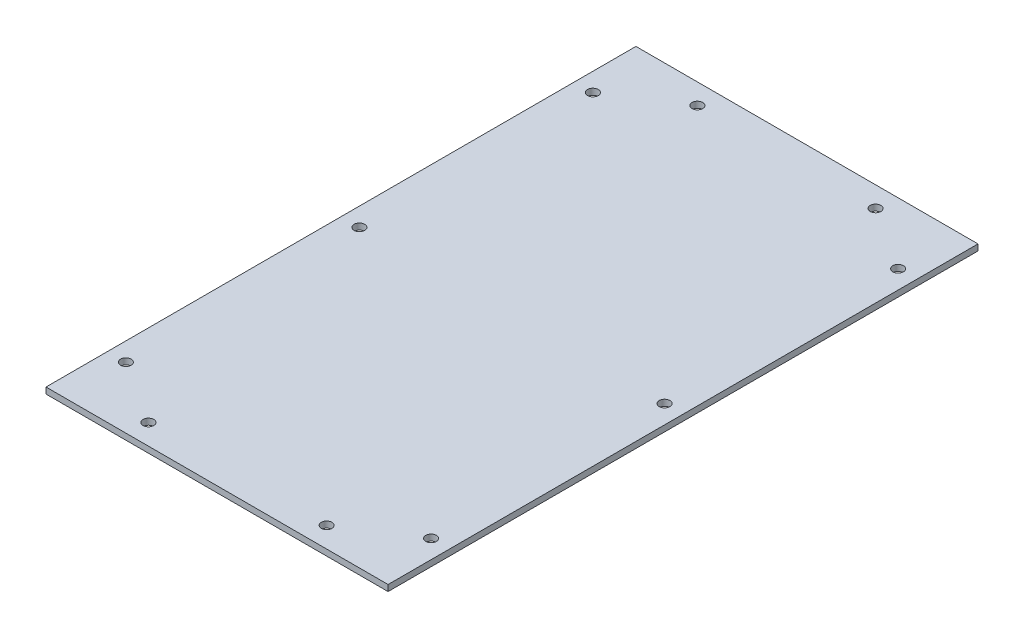
ISO-10303-21;
HEADER;
FILE_DESCRIPTION(('STEP AP214'),'2;1');
FILE_NAME('part.step','',(''),(''),'','','');
FILE_SCHEMA(('AUTOMOTIVE_DESIGN { 1 0 10303 214 1 1 1 1 }'));
ENDSEC;
DATA;
#1=APPLICATION_CONTEXT('core data for automotive mechanical design processes');
#2=APPLICATION_PROTOCOL_DEFINITION('international standard','automotive_design',2000,#1);
#3=PRODUCT_CONTEXT('',#1,'mechanical');
#4=PRODUCT('Part','Part','',(#3));
#5=PRODUCT_RELATED_PRODUCT_CATEGORY('part','',(#4));
#6=PRODUCT_DEFINITION_FORMATION('','',#4);
#7=PRODUCT_DEFINITION_CONTEXT('part definition',#1,'design');
#8=PRODUCT_DEFINITION('design','',#6,#7);
#9=PRODUCT_DEFINITION_SHAPE('','',#8);
#10=(LENGTH_UNIT() NAMED_UNIT(*) SI_UNIT(.MILLI.,.METRE.));
#11=(NAMED_UNIT(*) PLANE_ANGLE_UNIT() SI_UNIT($,.RADIAN.));
#12=(NAMED_UNIT(*) SI_UNIT($,.STERADIAN.) SOLID_ANGLE_UNIT());
#13=UNCERTAINTY_MEASURE_WITH_UNIT(LENGTH_MEASURE(1.E-05),#10,'distance_accuracy_value','');
#14=(GEOMETRIC_REPRESENTATION_CONTEXT(3) GLOBAL_UNCERTAINTY_ASSIGNED_CONTEXT((#13)) GLOBAL_UNIT_ASSIGNED_CONTEXT((#10,
#11,#12)) REPRESENTATION_CONTEXT('',''));
#15=CARTESIAN_POINT('',(0.,0.,0.));
#16=DIRECTION('',(0.,0.,1.));
#17=DIRECTION('',(1.,0.,0.));
#18=AXIS2_PLACEMENT_3D('',#15,#16,#17);
#19=CARTESIAN_POINT('',(0.,3.,0.));
#20=DIRECTION('',(0.,1.,0.));
#21=DIRECTION('',(0.,0.,1.));
#22=AXIS2_PLACEMENT_3D('',#19,#20,#21);
#23=PLANE('',#22);
#24=CARTESIAN_POINT('',(-43.5,3.,134.));
#25=DIRECTION('',(0.,1.,0.));
#26=DIRECTION('',(0.,0.,1.));
#27=AXIS2_PLACEMENT_3D('',#24,#25,#26);
#28=CIRCLE('',#27,2.59999999999999);
#29=CARTESIAN_POINT('',(-43.5,3.,136.6));
#30=VERTEX_POINT('',#29);
#31=EDGE_CURVE('E162',#30,#30,#28,.T.);
#32=ORIENTED_EDGE('',*,*,#31,.F.);
#33=EDGE_LOOP('',(#32));
#34=FACE_BOUND('',#33,.T.);
#35=CARTESIAN_POINT('',(-43.5,3.,-134.));
#36=DIRECTION('',(0.,1.,0.));
#37=DIRECTION('',(0.,0.,1.));
#38=AXIS2_PLACEMENT_3D('',#35,#36,#37);
#39=CIRCLE('',#38,2.59999999999999);
#40=CARTESIAN_POINT('',(-43.5,3.,-131.4));
#41=VERTEX_POINT('',#40);
#42=EDGE_CURVE('E150',#41,#41,#39,.T.);
#43=ORIENTED_EDGE('',*,*,#42,.F.);
#44=EDGE_LOOP('',(#43));
#45=FACE_BOUND('',#44,.T.);
#46=CARTESIAN_POINT('',(74.5000000000001,3.,0.));
#47=DIRECTION('',(0.,1.,0.));
#48=DIRECTION('',(0.,0.,1.));
#49=AXIS2_PLACEMENT_3D('',#46,#47,#48);
#50=CIRCLE('',#49,2.6);
#51=CARTESIAN_POINT('',(74.5000000000001,3.,2.6));
#52=VERTEX_POINT('',#51);
#53=EDGE_CURVE('E138',#52,#52,#50,.T.);
#54=ORIENTED_EDGE('',*,*,#53,.F.);
#55=EDGE_LOOP('',(#54));
#56=FACE_BOUND('',#55,.T.);
#57=CARTESIAN_POINT('',(-74.5,3.,114.));
#58=DIRECTION('',(0.,1.,0.));
#59=DIRECTION('',(0.,0.,1.));
#60=AXIS2_PLACEMENT_3D('',#57,#58,#59);
#61=CIRCLE('',#60,2.6);
#62=CARTESIAN_POINT('',(-74.5,3.,116.6));
#63=VERTEX_POINT('',#62);
#64=EDGE_CURVE('E126',#63,#63,#61,.T.);
#65=ORIENTED_EDGE('',*,*,#64,.F.);
#66=EDGE_LOOP('',(#65));
#67=FACE_BOUND('',#66,.T.);
#68=CARTESIAN_POINT('',(-74.5,3.,-114.));
#69=DIRECTION('',(0.,1.,0.));
#70=DIRECTION('',(0.,0.,1.));
#71=AXIS2_PLACEMENT_3D('',#68,#69,#70);
#72=CIRCLE('',#71,2.6);
#73=CARTESIAN_POINT('',(-74.5,3.,-111.4));
#74=VERTEX_POINT('',#73);
#75=EDGE_CURVE('E105',#74,#74,#72,.T.);
#76=ORIENTED_EDGE('',*,*,#75,.F.);
#77=EDGE_LOOP('',(#76));
#78=FACE_BOUND('',#77,.T.);
#79=DIRECTION('',(0.,0.,1.));
#80=VECTOR('',#79,1.);
#81=CARTESIAN_POINT('',(-83.5,3.,-144.));
#82=LINE('',#81,#80);
#83=CARTESIAN_POINT('',(-83.5,3.,-144.));
#84=VERTEX_POINT('',#83);
#85=CARTESIAN_POINT('',(-83.5,3.,144.));
#86=VERTEX_POINT('',#85);
#87=EDGE_CURVE('E90',#84,#86,#82,.T.);
#88=ORIENTED_EDGE('',*,*,#87,.T.);
#89=DIRECTION('',(1.,0.,0.));
#90=VECTOR('',#89,1.);
#91=CARTESIAN_POINT('',(-83.5,3.,144.));
#92=LINE('',#91,#90);
#93=CARTESIAN_POINT('',(83.5,3.,144.));
#94=VERTEX_POINT('',#93);
#95=EDGE_CURVE('E85',#86,#94,#92,.T.);
#96=ORIENTED_EDGE('',*,*,#95,.T.);
#97=DIRECTION('',(0.,0.,-1.));
#98=VECTOR('',#97,1.);
#99=CARTESIAN_POINT('',(83.5,3.,-144.));
#100=LINE('',#99,#98);
#101=CARTESIAN_POINT('',(83.5,3.,-144.));
#102=VERTEX_POINT('',#101);
#103=EDGE_CURVE('E88',#94,#102,#100,.T.);
#104=ORIENTED_EDGE('',*,*,#103,.T.);
#105=DIRECTION('',(-1.,0.,0.));
#106=VECTOR('',#105,1.);
#107=CARTESIAN_POINT('',(-83.5,3.,-144.));
#108=LINE('',#107,#106);
#109=EDGE_CURVE('E55',#102,#84,#108,.T.);
#110=ORIENTED_EDGE('',*,*,#109,.T.);
#111=EDGE_LOOP('',(#88,#96,#104,#110));
#112=FACE_BOUND('',#111,.T.);
#113=CARTESIAN_POINT('',(-74.5,3.,0.));
#114=DIRECTION('',(0.,1.,0.));
#115=DIRECTION('',(0.,0.,1.));
#116=AXIS2_PLACEMENT_3D('',#113,#114,#115);
#117=CIRCLE('',#116,2.6);
#118=CARTESIAN_POINT('',(-74.5,3.,2.6));
#119=VERTEX_POINT('',#118);
#120=EDGE_CURVE('E120',#119,#119,#117,.T.);
#121=ORIENTED_EDGE('',*,*,#120,.F.);
#122=EDGE_LOOP('',(#121));
#123=FACE_BOUND('',#122,.T.);
#124=CARTESIAN_POINT('',(74.5,3.,-114.));
#125=DIRECTION('',(0.,1.,0.));
#126=DIRECTION('',(0.,0.,1.));
#127=AXIS2_PLACEMENT_3D('',#124,#125,#126);
#128=CIRCLE('',#127,2.6);
#129=CARTESIAN_POINT('',(74.5,3.,-111.4));
#130=VERTEX_POINT('',#129);
#131=EDGE_CURVE('E132',#130,#130,#128,.T.);
#132=ORIENTED_EDGE('',*,*,#131,.F.);
#133=EDGE_LOOP('',(#132));
#134=FACE_BOUND('',#133,.T.);
#135=CARTESIAN_POINT('',(74.5000000000001,3.,114.));
#136=DIRECTION('',(0.,1.,0.));
#137=DIRECTION('',(0.,0.,1.));
#138=AXIS2_PLACEMENT_3D('',#135,#136,#137);
#139=CIRCLE('',#138,2.6);
#140=CARTESIAN_POINT('',(74.5000000000001,3.,116.6));
#141=VERTEX_POINT('',#140);
#142=EDGE_CURVE('E144',#141,#141,#139,.T.);
#143=ORIENTED_EDGE('',*,*,#142,.F.);
#144=EDGE_LOOP('',(#143));
#145=FACE_BOUND('',#144,.T.);
#146=CARTESIAN_POINT('',(43.5,3.,-134.));
#147=DIRECTION('',(0.,1.,0.));
#148=DIRECTION('',(0.,0.,1.));
#149=AXIS2_PLACEMENT_3D('',#146,#147,#148);
#150=CIRCLE('',#149,2.59999999999999);
#151=CARTESIAN_POINT('',(43.5,3.,-131.4));
#152=VERTEX_POINT('',#151);
#153=EDGE_CURVE('E156',#152,#152,#150,.T.);
#154=ORIENTED_EDGE('',*,*,#153,.F.);
#155=EDGE_LOOP('',(#154));
#156=FACE_BOUND('',#155,.T.);
#157=CARTESIAN_POINT('',(43.5,3.,134.));
#158=DIRECTION('',(0.,1.,0.));
#159=DIRECTION('',(0.,0.,1.));
#160=AXIS2_PLACEMENT_3D('',#157,#158,#159);
#161=CIRCLE('',#160,2.59999999999999);
#162=CARTESIAN_POINT('',(43.5,3.,136.6));
#163=VERTEX_POINT('',#162);
#164=EDGE_CURVE('E168',#163,#163,#161,.T.);
#165=ORIENTED_EDGE('',*,*,#164,.F.);
#166=EDGE_LOOP('',(#165));
#167=FACE_BOUND('',#166,.T.);
#168=ADVANCED_FACE('F38',(#34,#45,#56,#67,#78,#112,#123,#134,#145,#156,#167),#23,.T.);
#169=CARTESIAN_POINT('',(0.,0.,0.));
#170=DIRECTION('',(0.,1.,0.));
#171=DIRECTION('',(0.,0.,1.));
#172=AXIS2_PLACEMENT_3D('',#169,#170,#171);
#173=PLANE('',#172);
#174=DIRECTION('',(0.,0.,1.));
#175=VECTOR('',#174,1.);
#176=CARTESIAN_POINT('',(-83.5,0.,-144.));
#177=LINE('',#176,#175);
#178=CARTESIAN_POINT('',(-83.5,0.,-144.));
#179=VERTEX_POINT('',#178);
#180=CARTESIAN_POINT('',(-83.5,0.,144.));
#181=VERTEX_POINT('',#180);
#182=EDGE_CURVE('E102',#179,#181,#177,.T.);
#183=ORIENTED_EDGE('',*,*,#182,.F.);
#184=DIRECTION('',(-1.,0.,0.));
#185=VECTOR('',#184,1.);
#186=CARTESIAN_POINT('',(-83.5,0.,-144.));
#187=LINE('',#186,#185);
#188=CARTESIAN_POINT('',(83.5,0.,-144.));
#189=VERTEX_POINT('',#188);
#190=EDGE_CURVE('E78',#189,#179,#187,.T.);
#191=ORIENTED_EDGE('',*,*,#190,.F.);
#192=DIRECTION('',(0.,0.,-1.));
#193=VECTOR('',#192,1.);
#194=CARTESIAN_POINT('',(83.5,0.,-144.));
#195=LINE('',#194,#193);
#196=CARTESIAN_POINT('',(83.5,0.,144.));
#197=VERTEX_POINT('',#196);
#198=EDGE_CURVE('E72',#197,#189,#195,.T.);
#199=ORIENTED_EDGE('',*,*,#198,.F.);
#200=DIRECTION('',(1.,0.,0.));
#201=VECTOR('',#200,1.);
#202=CARTESIAN_POINT('',(-83.5,0.,144.));
#203=LINE('',#202,#201);
#204=EDGE_CURVE('E94',#181,#197,#203,.T.);
#205=ORIENTED_EDGE('',*,*,#204,.F.);
#206=EDGE_LOOP('',(#183,#191,#199,#205));
#207=FACE_BOUND('',#206,.T.);
#208=CARTESIAN_POINT('',(-74.5,0.,-114.));
#209=DIRECTION('',(0.,1.,0.));
#210=DIRECTION('',(0.,0.,1.));
#211=AXIS2_PLACEMENT_3D('',#208,#209,#210);
#212=CIRCLE('',#211,2.6);
#213=CARTESIAN_POINT('',(-74.5,0.,-111.4));
#214=VERTEX_POINT('',#213);
#215=EDGE_CURVE('E117',#214,#214,#212,.T.);
#216=ORIENTED_EDGE('',*,*,#215,.T.);
#217=EDGE_LOOP('',(#216));
#218=FACE_BOUND('',#217,.T.);
#219=CARTESIAN_POINT('',(-74.5,0.,0.));
#220=DIRECTION('',(0.,1.,0.));
#221=DIRECTION('',(0.,0.,1.));
#222=AXIS2_PLACEMENT_3D('',#219,#220,#221);
#223=CIRCLE('',#222,2.6);
#224=CARTESIAN_POINT('',(-74.5,0.,2.6));
#225=VERTEX_POINT('',#224);
#226=EDGE_CURVE('E123',#225,#225,#223,.T.);
#227=ORIENTED_EDGE('',*,*,#226,.T.);
#228=EDGE_LOOP('',(#227));
#229=FACE_BOUND('',#228,.T.);
#230=CARTESIAN_POINT('',(-74.5,0.,114.));
#231=DIRECTION('',(0.,1.,0.));
#232=DIRECTION('',(0.,0.,1.));
#233=AXIS2_PLACEMENT_3D('',#230,#231,#232);
#234=CIRCLE('',#233,2.6);
#235=CARTESIAN_POINT('',(-74.5,0.,116.6));
#236=VERTEX_POINT('',#235);
#237=EDGE_CURVE('E129',#236,#236,#234,.T.);
#238=ORIENTED_EDGE('',*,*,#237,.T.);
#239=EDGE_LOOP('',(#238));
#240=FACE_BOUND('',#239,.T.);
#241=CARTESIAN_POINT('',(74.5,0.,-114.));
#242=DIRECTION('',(0.,1.,0.));
#243=DIRECTION('',(0.,0.,1.));
#244=AXIS2_PLACEMENT_3D('',#241,#242,#243);
#245=CIRCLE('',#244,2.6);
#246=CARTESIAN_POINT('',(74.5,0.,-111.4));
#247=VERTEX_POINT('',#246);
#248=EDGE_CURVE('E135',#247,#247,#245,.T.);
#249=ORIENTED_EDGE('',*,*,#248,.T.);
#250=EDGE_LOOP('',(#249));
#251=FACE_BOUND('',#250,.T.);
#252=CARTESIAN_POINT('',(74.5000000000001,0.,0.));
#253=DIRECTION('',(0.,1.,0.));
#254=DIRECTION('',(0.,0.,1.));
#255=AXIS2_PLACEMENT_3D('',#252,#253,#254);
#256=CIRCLE('',#255,2.6);
#257=CARTESIAN_POINT('',(74.5000000000001,0.,2.6));
#258=VERTEX_POINT('',#257);
#259=EDGE_CURVE('E141',#258,#258,#256,.T.);
#260=ORIENTED_EDGE('',*,*,#259,.T.);
#261=EDGE_LOOP('',(#260));
#262=FACE_BOUND('',#261,.T.);
#263=CARTESIAN_POINT('',(74.5000000000001,0.,114.));
#264=DIRECTION('',(0.,1.,0.));
#265=DIRECTION('',(0.,0.,1.));
#266=AXIS2_PLACEMENT_3D('',#263,#264,#265);
#267=CIRCLE('',#266,2.6);
#268=CARTESIAN_POINT('',(74.5000000000001,0.,116.6));
#269=VERTEX_POINT('',#268);
#270=EDGE_CURVE('E147',#269,#269,#267,.T.);
#271=ORIENTED_EDGE('',*,*,#270,.T.);
#272=EDGE_LOOP('',(#271));
#273=FACE_BOUND('',#272,.T.);
#274=CARTESIAN_POINT('',(-43.5,0.,-134.));
#275=DIRECTION('',(0.,1.,0.));
#276=DIRECTION('',(0.,0.,1.));
#277=AXIS2_PLACEMENT_3D('',#274,#275,#276);
#278=CIRCLE('',#277,2.59999999999999);
#279=CARTESIAN_POINT('',(-43.5,0.,-131.4));
#280=VERTEX_POINT('',#279);
#281=EDGE_CURVE('E153',#280,#280,#278,.T.);
#282=ORIENTED_EDGE('',*,*,#281,.T.);
#283=EDGE_LOOP('',(#282));
#284=FACE_BOUND('',#283,.T.);
#285=CARTESIAN_POINT('',(43.5,0.,-134.));
#286=DIRECTION('',(0.,1.,0.));
#287=DIRECTION('',(0.,0.,1.));
#288=AXIS2_PLACEMENT_3D('',#285,#286,#287);
#289=CIRCLE('',#288,2.59999999999999);
#290=CARTESIAN_POINT('',(43.5,0.,-131.4));
#291=VERTEX_POINT('',#290);
#292=EDGE_CURVE('E159',#291,#291,#289,.T.);
#293=ORIENTED_EDGE('',*,*,#292,.T.);
#294=EDGE_LOOP('',(#293));
#295=FACE_BOUND('',#294,.T.);
#296=CARTESIAN_POINT('',(-43.5,0.,134.));
#297=DIRECTION('',(0.,1.,0.));
#298=DIRECTION('',(0.,0.,1.));
#299=AXIS2_PLACEMENT_3D('',#296,#297,#298);
#300=CIRCLE('',#299,2.59999999999999);
#301=CARTESIAN_POINT('',(-43.5,0.,136.6));
#302=VERTEX_POINT('',#301);
#303=EDGE_CURVE('E165',#302,#302,#300,.T.);
#304=ORIENTED_EDGE('',*,*,#303,.T.);
#305=EDGE_LOOP('',(#304));
#306=FACE_BOUND('',#305,.T.);
#307=CARTESIAN_POINT('',(43.5,0.,134.));
#308=DIRECTION('',(0.,1.,0.));
#309=DIRECTION('',(0.,0.,1.));
#310=AXIS2_PLACEMENT_3D('',#307,#308,#309);
#311=CIRCLE('',#310,2.59999999999999);
#312=CARTESIAN_POINT('',(43.5,0.,136.6));
#313=VERTEX_POINT('',#312);
#314=EDGE_CURVE('E171',#313,#313,#311,.T.);
#315=ORIENTED_EDGE('',*,*,#314,.T.);
#316=EDGE_LOOP('',(#315));
#317=FACE_BOUND('',#316,.T.);
#318=ADVANCED_FACE('F113',(#207,#218,#229,#240,#251,#262,#273,#284,#295,#306,#317),#173,.F.);
#319=CARTESIAN_POINT('',(-83.5,3.,-144.));
#320=DIRECTION('',(1.,0.,0.));
#321=DIRECTION('',(0.,0.,-1.));
#322=AXIS2_PLACEMENT_3D('',#319,#320,#321);
#323=PLANE('',#322);
#324=ORIENTED_EDGE('',*,*,#182,.T.);
#325=DIRECTION('',(0.,-1.,0.));
#326=VECTOR('',#325,1.);
#327=CARTESIAN_POINT('',(-83.5,3.,144.));
#328=LINE('',#327,#326);
#329=EDGE_CURVE('E11',#86,#181,#328,.T.);
#330=ORIENTED_EDGE('',*,*,#329,.F.);
#331=ORIENTED_EDGE('',*,*,#87,.F.);
#332=DIRECTION('',(0.,-1.,0.));
#333=VECTOR('',#332,1.);
#334=CARTESIAN_POINT('',(-83.5,3.,-144.));
#335=LINE('',#334,#333);
#336=EDGE_CURVE('E98',#84,#179,#335,.T.);
#337=ORIENTED_EDGE('',*,*,#336,.T.);
#338=EDGE_LOOP('',(#324,#330,#331,#337));
#339=FACE_BOUND('',#338,.T.);
#340=ADVANCED_FACE('F40',(#339),#323,.F.);
#341=CARTESIAN_POINT('',(-83.5,3.,144.));
#342=DIRECTION('',(0.,0.,-1.));
#343=DIRECTION('',(-1.,0.,0.));
#344=AXIS2_PLACEMENT_3D('',#341,#342,#343);
#345=PLANE('',#344);
#346=ORIENTED_EDGE('',*,*,#204,.T.);
#347=DIRECTION('',(0.,-1.,0.));
#348=VECTOR('',#347,1.);
#349=CARTESIAN_POINT('',(83.5,3.,144.));
#350=LINE('',#349,#348);
#351=EDGE_CURVE('E47',#94,#197,#350,.T.);
#352=ORIENTED_EDGE('',*,*,#351,.F.);
#353=ORIENTED_EDGE('',*,*,#95,.F.);
#354=ORIENTED_EDGE('',*,*,#329,.T.);
#355=EDGE_LOOP('',(#346,#352,#353,#354));
#356=FACE_BOUND('',#355,.T.);
#357=ADVANCED_FACE('F93',(#356),#345,.F.);
#358=CARTESIAN_POINT('',(83.5,3.,-144.));
#359=DIRECTION('',(-1.,0.,0.));
#360=DIRECTION('',(0.,0.,1.));
#361=AXIS2_PLACEMENT_3D('',#358,#359,#360);
#362=PLANE('',#361);
#363=ORIENTED_EDGE('',*,*,#198,.T.);
#364=DIRECTION('',(0.,-1.,0.));
#365=VECTOR('',#364,1.);
#366=CARTESIAN_POINT('',(83.5,3.,-144.));
#367=LINE('',#366,#365);
#368=EDGE_CURVE('E95',#102,#189,#367,.T.);
#369=ORIENTED_EDGE('',*,*,#368,.F.);
#370=ORIENTED_EDGE('',*,*,#103,.F.);
#371=ORIENTED_EDGE('',*,*,#351,.T.);
#372=EDGE_LOOP('',(#363,#369,#370,#371));
#373=FACE_BOUND('',#372,.T.);
#374=ADVANCED_FACE('F96',(#373),#362,.F.);
#375=CARTESIAN_POINT('',(-83.5,3.,-144.));
#376=DIRECTION('',(0.,0.,1.));
#377=DIRECTION('',(1.,0.,0.));
#378=AXIS2_PLACEMENT_3D('',#375,#376,#377);
#379=PLANE('',#378);
#380=ORIENTED_EDGE('',*,*,#190,.T.);
#381=ORIENTED_EDGE('',*,*,#336,.F.);
#382=ORIENTED_EDGE('',*,*,#109,.F.);
#383=ORIENTED_EDGE('',*,*,#368,.T.);
#384=EDGE_LOOP('',(#380,#381,#382,#383));
#385=FACE_BOUND('',#384,.T.);
#386=ADVANCED_FACE('F110',(#385),#379,.F.);
#387=CARTESIAN_POINT('',(-74.5,3.,-114.));
#388=DIRECTION('',(0.,-1.,0.));
#389=DIRECTION('',(0.,0.,-1.));
#390=AXIS2_PLACEMENT_3D('',#387,#388,#389);
#391=CYLINDRICAL_SURFACE('',#390,2.6);
#392=ORIENTED_EDGE('',*,*,#75,.T.);
#393=EDGE_LOOP('',(#392));
#394=FACE_BOUND('',#393,.T.);
#395=ORIENTED_EDGE('',*,*,#215,.F.);
#396=EDGE_LOOP('',(#395));
#397=FACE_BOUND('',#396,.T.);
#398=ADVANCED_FACE('F190',(#394,#397),#391,.F.);
#399=CARTESIAN_POINT('',(-74.5,3.,0.));
#400=DIRECTION('',(0.,-1.,0.));
#401=DIRECTION('',(0.,0.,-1.));
#402=AXIS2_PLACEMENT_3D('',#399,#400,#401);
#403=CYLINDRICAL_SURFACE('',#402,2.6);
#404=ORIENTED_EDGE('',*,*,#120,.T.);
#405=EDGE_LOOP('',(#404));
#406=FACE_BOUND('',#405,.T.);
#407=ORIENTED_EDGE('',*,*,#226,.F.);
#408=EDGE_LOOP('',(#407));
#409=FACE_BOUND('',#408,.T.);
#410=ADVANCED_FACE('F244',(#406,#409),#403,.F.);
#411=CARTESIAN_POINT('',(-74.5,3.,114.));
#412=DIRECTION('',(0.,-1.,0.));
#413=DIRECTION('',(0.,0.,-1.));
#414=AXIS2_PLACEMENT_3D('',#411,#412,#413);
#415=CYLINDRICAL_SURFACE('',#414,2.6);
#416=ORIENTED_EDGE('',*,*,#64,.T.);
#417=EDGE_LOOP('',(#416));
#418=FACE_BOUND('',#417,.T.);
#419=ORIENTED_EDGE('',*,*,#237,.F.);
#420=EDGE_LOOP('',(#419));
#421=FACE_BOUND('',#420,.T.);
#422=ADVANCED_FACE('F253',(#418,#421),#415,.F.);
#423=CARTESIAN_POINT('',(74.5,3.,-114.));
#424=DIRECTION('',(0.,-1.,0.));
#425=DIRECTION('',(0.,0.,-1.));
#426=AXIS2_PLACEMENT_3D('',#423,#424,#425);
#427=CYLINDRICAL_SURFACE('',#426,2.6);
#428=ORIENTED_EDGE('',*,*,#131,.T.);
#429=EDGE_LOOP('',(#428));
#430=FACE_BOUND('',#429,.T.);
#431=ORIENTED_EDGE('',*,*,#248,.F.);
#432=EDGE_LOOP('',(#431));
#433=FACE_BOUND('',#432,.T.);
#434=ADVANCED_FACE('F262',(#430,#433),#427,.F.);
#435=CARTESIAN_POINT('',(74.5000000000001,3.,0.));
#436=DIRECTION('',(0.,-1.,0.));
#437=DIRECTION('',(0.,0.,-1.));
#438=AXIS2_PLACEMENT_3D('',#435,#436,#437);
#439=CYLINDRICAL_SURFACE('',#438,2.6);
#440=ORIENTED_EDGE('',*,*,#53,.T.);
#441=EDGE_LOOP('',(#440));
#442=FACE_BOUND('',#441,.T.);
#443=ORIENTED_EDGE('',*,*,#259,.F.);
#444=EDGE_LOOP('',(#443));
#445=FACE_BOUND('',#444,.T.);
#446=ADVANCED_FACE('F272',(#442,#445),#439,.F.);
#447=CARTESIAN_POINT('',(74.5000000000001,3.,114.));
#448=DIRECTION('',(0.,-1.,0.));
#449=DIRECTION('',(0.,0.,-1.));
#450=AXIS2_PLACEMENT_3D('',#447,#448,#449);
#451=CYLINDRICAL_SURFACE('',#450,2.6);
#452=ORIENTED_EDGE('',*,*,#142,.T.);
#453=EDGE_LOOP('',(#452));
#454=FACE_BOUND('',#453,.T.);
#455=ORIENTED_EDGE('',*,*,#270,.F.);
#456=EDGE_LOOP('',(#455));
#457=FACE_BOUND('',#456,.T.);
#458=ADVANCED_FACE('F282',(#454,#457),#451,.F.);
#459=CARTESIAN_POINT('',(-43.5,3.,-134.));
#460=DIRECTION('',(0.,-1.,0.));
#461=DIRECTION('',(0.,0.,-1.));
#462=AXIS2_PLACEMENT_3D('',#459,#460,#461);
#463=CYLINDRICAL_SURFACE('',#462,2.59999999999999);
#464=ORIENTED_EDGE('',*,*,#42,.T.);
#465=EDGE_LOOP('',(#464));
#466=FACE_BOUND('',#465,.T.);
#467=ORIENTED_EDGE('',*,*,#281,.F.);
#468=EDGE_LOOP('',(#467));
#469=FACE_BOUND('',#468,.T.);
#470=ADVANCED_FACE('F292',(#466,#469),#463,.F.);
#471=CARTESIAN_POINT('',(43.5,3.,-134.));
#472=DIRECTION('',(0.,-1.,0.));
#473=DIRECTION('',(0.,0.,-1.));
#474=AXIS2_PLACEMENT_3D('',#471,#472,#473);
#475=CYLINDRICAL_SURFACE('',#474,2.59999999999999);
#476=ORIENTED_EDGE('',*,*,#153,.T.);
#477=EDGE_LOOP('',(#476));
#478=FACE_BOUND('',#477,.T.);
#479=ORIENTED_EDGE('',*,*,#292,.F.);
#480=EDGE_LOOP('',(#479));
#481=FACE_BOUND('',#480,.T.);
#482=ADVANCED_FACE('F302',(#478,#481),#475,.F.);
#483=CARTESIAN_POINT('',(-43.5,3.,134.));
#484=DIRECTION('',(0.,-1.,0.));
#485=DIRECTION('',(0.,0.,-1.));
#486=AXIS2_PLACEMENT_3D('',#483,#484,#485);
#487=CYLINDRICAL_SURFACE('',#486,2.59999999999999);
#488=ORIENTED_EDGE('',*,*,#31,.T.);
#489=EDGE_LOOP('',(#488));
#490=FACE_BOUND('',#489,.T.);
#491=ORIENTED_EDGE('',*,*,#303,.F.);
#492=EDGE_LOOP('',(#491));
#493=FACE_BOUND('',#492,.T.);
#494=ADVANCED_FACE('F312',(#490,#493),#487,.F.);
#495=CARTESIAN_POINT('',(43.5,3.,134.));
#496=DIRECTION('',(0.,-1.,0.));
#497=DIRECTION('',(0.,0.,-1.));
#498=AXIS2_PLACEMENT_3D('',#495,#496,#497);
#499=CYLINDRICAL_SURFACE('',#498,2.59999999999999);
#500=ORIENTED_EDGE('',*,*,#164,.T.);
#501=EDGE_LOOP('',(#500));
#502=FACE_BOUND('',#501,.T.);
#503=ORIENTED_EDGE('',*,*,#314,.F.);
#504=EDGE_LOOP('',(#503));
#505=FACE_BOUND('',#504,.T.);
#506=ADVANCED_FACE('F177',(#502,#505),#499,.F.);
#507=CLOSED_SHELL('',(#168,#318,#340,#357,#374,#386,#398,#410,#422,#434,#446,#458,#470,#482,
#494,#506));
#508=MANIFOLD_SOLID_BREP('B2',#507);
#509=ADVANCED_BREP_SHAPE_REPRESENTATION('',(#18,#508),#14);
#510=SHAPE_DEFINITION_REPRESENTATION(#9,#509);
ENDSEC;
END-ISO-10303-21;
